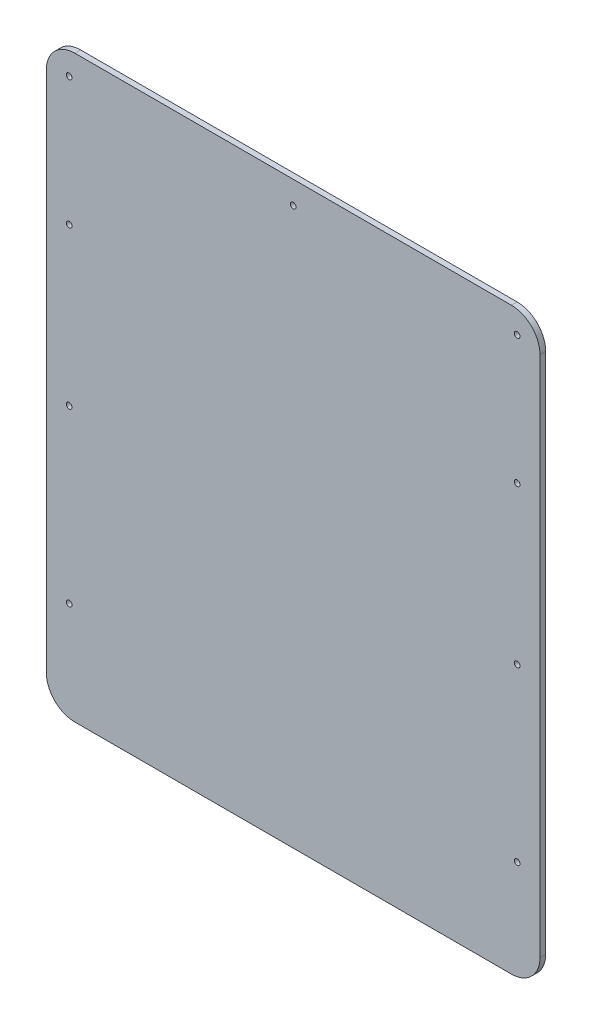
ISO-10303-21;
HEADER;
FILE_DESCRIPTION(('STEP AP214'),'2;1');
FILE_NAME('part.step','',(''),(''),'','','');
FILE_SCHEMA(('AUTOMOTIVE_DESIGN { 1 0 10303 214 1 1 1 1 }'));
ENDSEC;
DATA;
#1=APPLICATION_CONTEXT('core data for automotive mechanical design processes');
#2=APPLICATION_PROTOCOL_DEFINITION('international standard','automotive_design',2000,#1);
#3=PRODUCT_CONTEXT('',#1,'mechanical');
#4=PRODUCT('Part','Part','',(#3));
#5=PRODUCT_RELATED_PRODUCT_CATEGORY('part','',(#4));
#6=PRODUCT_DEFINITION_FORMATION('','',#4);
#7=PRODUCT_DEFINITION_CONTEXT('part definition',#1,'design');
#8=PRODUCT_DEFINITION('design','',#6,#7);
#9=PRODUCT_DEFINITION_SHAPE('','',#8);
#10=(LENGTH_UNIT() NAMED_UNIT(*) SI_UNIT(.MILLI.,.METRE.));
#11=(NAMED_UNIT(*) PLANE_ANGLE_UNIT() SI_UNIT($,.RADIAN.));
#12=(NAMED_UNIT(*) SI_UNIT($,.STERADIAN.) SOLID_ANGLE_UNIT());
#13=UNCERTAINTY_MEASURE_WITH_UNIT(LENGTH_MEASURE(1.E-05),#10,'distance_accuracy_value','');
#14=(GEOMETRIC_REPRESENTATION_CONTEXT(3) GLOBAL_UNCERTAINTY_ASSIGNED_CONTEXT((#13)) GLOBAL_UNIT_ASSIGNED_CONTEXT((#10,
#11,#12)) REPRESENTATION_CONTEXT('',''));
#15=CARTESIAN_POINT('',(0.,0.,0.));
#16=DIRECTION('',(0.,0.,1.));
#17=DIRECTION('',(1.,0.,0.));
#18=AXIS2_PLACEMENT_3D('',#15,#16,#17);
#19=CARTESIAN_POINT('',(-153.,183.,4.));
#20=DIRECTION('',(0.,0.,-1.));
#21=DIRECTION('',(-1.,0.,0.));
#22=AXIS2_PLACEMENT_3D('',#19,#20,#21);
#23=CYLINDRICAL_SURFACE('',#22,20.);
#24=CARTESIAN_POINT('',(-153.,183.,0.));
#25=DIRECTION('',(0.,0.,1.));
#26=DIRECTION('',(1.,0.,0.));
#27=AXIS2_PLACEMENT_3D('',#24,#25,#26);
#28=CIRCLE('',#27,20.);
#29=CARTESIAN_POINT('',(-173.,183.,0.));
#30=VERTEX_POINT('',#29);
#31=CARTESIAN_POINT('',(-153.,203.,0.));
#32=VERTEX_POINT('',#31);
#33=EDGE_CURVE('E158',#30,#32,#28,.F.);
#34=ORIENTED_EDGE('',*,*,#33,.F.);
#35=DIRECTION('',(0.,0.,-1.));
#36=VECTOR('',#35,1.);
#37=CARTESIAN_POINT('',(-173.,183.,4.));
#38=LINE('',#37,#36);
#39=CARTESIAN_POINT('',(-173.,183.,4.));
#40=VERTEX_POINT('',#39);
#41=EDGE_CURVE('E11',#40,#30,#38,.T.);
#42=ORIENTED_EDGE('',*,*,#41,.F.);
#43=CARTESIAN_POINT('',(-153.,183.,4.));
#44=DIRECTION('',(0.,0.,1.));
#45=DIRECTION('',(1.,0.,0.));
#46=AXIS2_PLACEMENT_3D('',#43,#44,#45);
#47=CIRCLE('',#46,20.);
#48=CARTESIAN_POINT('',(-153.,203.,4.));
#49=VERTEX_POINT('',#48);
#50=EDGE_CURVE('E205',#40,#49,#47,.F.);
#51=ORIENTED_EDGE('',*,*,#50,.T.);
#52=DIRECTION('',(0.,0.,-1.));
#53=VECTOR('',#52,1.);
#54=CARTESIAN_POINT('',(-153.,203.,4.));
#55=LINE('',#54,#53);
#56=EDGE_CURVE('E51',#49,#32,#55,.T.);
#57=ORIENTED_EDGE('',*,*,#56,.T.);
#58=EDGE_LOOP('',(#34,#42,#51,#57));
#59=FACE_BOUND('',#58,.T.);
#60=ADVANCED_FACE('F35',(#59),#23,.T.);
#61=CARTESIAN_POINT('',(-173.,0.,4.));
#62=DIRECTION('',(1.,0.,0.));
#63=DIRECTION('',(0.,1.,0.));
#64=AXIS2_PLACEMENT_3D('',#61,#62,#63);
#65=PLANE('',#64);
#66=DIRECTION('',(0.,-1.,0.));
#67=VECTOR('',#66,1.);
#68=CARTESIAN_POINT('',(-173.,0.,0.));
#69=LINE('',#68,#67);
#70=CARTESIAN_POINT('',(-173.,-183.,0.));
#71=VERTEX_POINT('',#70);
#72=EDGE_CURVE('E160',#30,#71,#69,.T.);
#73=ORIENTED_EDGE('',*,*,#72,.T.);
#74=DIRECTION('',(0.,0.,-1.));
#75=VECTOR('',#74,1.);
#76=CARTESIAN_POINT('',(-173.,-183.,4.));
#77=LINE('',#76,#75);
#78=CARTESIAN_POINT('',(-173.,-183.,4.));
#79=VERTEX_POINT('',#78);
#80=EDGE_CURVE('E43',#79,#71,#77,.T.);
#81=ORIENTED_EDGE('',*,*,#80,.F.);
#82=DIRECTION('',(0.,-1.,0.));
#83=VECTOR('',#82,1.);
#84=CARTESIAN_POINT('',(-173.,0.,4.));
#85=LINE('',#84,#83);
#86=EDGE_CURVE('E231',#40,#79,#85,.T.);
#87=ORIENTED_EDGE('',*,*,#86,.F.);
#88=ORIENTED_EDGE('',*,*,#41,.T.);
#89=EDGE_LOOP('',(#73,#81,#87,#88));
#90=FACE_BOUND('',#89,.T.);
#91=ADVANCED_FACE('F221',(#90),#65,.F.);
#92=CARTESIAN_POINT('',(-153.,-183.,4.));
#93=DIRECTION('',(0.,0.,-1.));
#94=DIRECTION('',(-1.,0.,0.));
#95=AXIS2_PLACEMENT_3D('',#92,#93,#94);
#96=CYLINDRICAL_SURFACE('',#95,20.);
#97=CARTESIAN_POINT('',(-153.,-183.,0.));
#98=DIRECTION('',(0.,0.,1.));
#99=DIRECTION('',(1.,0.,0.));
#100=AXIS2_PLACEMENT_3D('',#97,#98,#99);
#101=CIRCLE('',#100,20.);
#102=CARTESIAN_POINT('',(-153.,-203.,0.));
#103=VERTEX_POINT('',#102);
#104=EDGE_CURVE('E163',#103,#71,#101,.F.);
#105=ORIENTED_EDGE('',*,*,#104,.F.);
#106=DIRECTION('',(0.,0.,-1.));
#107=VECTOR('',#106,1.);
#108=CARTESIAN_POINT('',(-153.,-203.,4.));
#109=LINE('',#108,#107);
#110=CARTESIAN_POINT('',(-153.,-203.,4.));
#111=VERTEX_POINT('',#110);
#112=EDGE_CURVE('E211',#111,#103,#109,.T.);
#113=ORIENTED_EDGE('',*,*,#112,.F.);
#114=CARTESIAN_POINT('',(-153.,-183.,4.));
#115=DIRECTION('',(0.,0.,1.));
#116=DIRECTION('',(1.,0.,0.));
#117=AXIS2_PLACEMENT_3D('',#114,#115,#116);
#118=CIRCLE('',#117,20.);
#119=EDGE_CURVE('E218',#111,#79,#118,.F.);
#120=ORIENTED_EDGE('',*,*,#119,.T.);
#121=ORIENTED_EDGE('',*,*,#80,.T.);
#122=EDGE_LOOP('',(#105,#113,#120,#121));
#123=FACE_BOUND('',#122,.T.);
#124=ADVANCED_FACE('F216',(#123),#96,.T.);
#125=CARTESIAN_POINT('',(0.,-203.,4.));
#126=DIRECTION('',(0.,1.,0.));
#127=DIRECTION('',(0.,0.,1.));
#128=AXIS2_PLACEMENT_3D('',#125,#126,#127);
#129=PLANE('',#128);
#130=DIRECTION('',(1.,0.,0.));
#131=VECTOR('',#130,1.);
#132=CARTESIAN_POINT('',(0.,-203.,0.));
#133=LINE('',#132,#131);
#134=CARTESIAN_POINT('',(153.,-203.,0.));
#135=VERTEX_POINT('',#134);
#136=EDGE_CURVE('E166',#103,#135,#133,.T.);
#137=ORIENTED_EDGE('',*,*,#136,.T.);
#138=DIRECTION('',(0.,0.,-1.));
#139=VECTOR('',#138,1.);
#140=CARTESIAN_POINT('',(153.,-203.,4.));
#141=LINE('',#140,#139);
#142=CARTESIAN_POINT('',(153.,-203.,4.));
#143=VERTEX_POINT('',#142);
#144=EDGE_CURVE('E209',#143,#135,#141,.T.);
#145=ORIENTED_EDGE('',*,*,#144,.F.);
#146=DIRECTION('',(1.,0.,0.));
#147=VECTOR('',#146,1.);
#148=CARTESIAN_POINT('',(0.,-203.,4.));
#149=LINE('',#148,#147);
#150=EDGE_CURVE('E126',#111,#143,#149,.T.);
#151=ORIENTED_EDGE('',*,*,#150,.F.);
#152=ORIENTED_EDGE('',*,*,#112,.T.);
#153=EDGE_LOOP('',(#137,#145,#151,#152));
#154=FACE_BOUND('',#153,.T.);
#155=ADVANCED_FACE('F229',(#154),#129,.F.);
#156=CARTESIAN_POINT('',(153.,-183.,4.));
#157=DIRECTION('',(0.,0.,-1.));
#158=DIRECTION('',(-1.,0.,0.));
#159=AXIS2_PLACEMENT_3D('',#156,#157,#158);
#160=CYLINDRICAL_SURFACE('',#159,20.);
#161=CARTESIAN_POINT('',(153.,-183.,0.));
#162=DIRECTION('',(0.,0.,1.));
#163=DIRECTION('',(1.,0.,0.));
#164=AXIS2_PLACEMENT_3D('',#161,#162,#163);
#165=CIRCLE('',#164,20.);
#166=CARTESIAN_POINT('',(173.,-183.,0.));
#167=VERTEX_POINT('',#166);
#168=EDGE_CURVE('E169',#167,#135,#165,.F.);
#169=ORIENTED_EDGE('',*,*,#168,.F.);
#170=DIRECTION('',(0.,0.,-1.));
#171=VECTOR('',#170,1.);
#172=CARTESIAN_POINT('',(173.,-183.,4.));
#173=LINE('',#172,#171);
#174=CARTESIAN_POINT('',(173.,-183.,4.));
#175=VERTEX_POINT('',#174);
#176=EDGE_CURVE('E111',#175,#167,#173,.T.);
#177=ORIENTED_EDGE('',*,*,#176,.F.);
#178=CARTESIAN_POINT('',(153.,-183.,4.));
#179=DIRECTION('',(0.,0.,1.));
#180=DIRECTION('',(1.,0.,0.));
#181=AXIS2_PLACEMENT_3D('',#178,#179,#180);
#182=CIRCLE('',#181,20.);
#183=EDGE_CURVE('E124',#175,#143,#182,.F.);
#184=ORIENTED_EDGE('',*,*,#183,.T.);
#185=ORIENTED_EDGE('',*,*,#144,.T.);
#186=EDGE_LOOP('',(#169,#177,#184,#185));
#187=FACE_BOUND('',#186,.T.);
#188=ADVANCED_FACE('F261',(#187),#160,.T.);
#189=CARTESIAN_POINT('',(173.,0.,4.));
#190=DIRECTION('',(1.,0.,0.));
#191=DIRECTION('',(0.,1.,0.));
#192=AXIS2_PLACEMENT_3D('',#189,#190,#191);
#193=PLANE('',#192);
#194=DIRECTION('',(0.,-1.,0.));
#195=VECTOR('',#194,1.);
#196=CARTESIAN_POINT('',(173.,0.,0.));
#197=LINE('',#196,#195);
#198=CARTESIAN_POINT('',(173.,183.,0.));
#199=VERTEX_POINT('',#198);
#200=EDGE_CURVE('E108',#199,#167,#197,.T.);
#201=ORIENTED_EDGE('',*,*,#200,.F.);
#202=DIRECTION('',(0.,0.,-1.));
#203=VECTOR('',#202,1.);
#204=CARTESIAN_POINT('',(173.,183.,4.));
#205=LINE('',#204,#203);
#206=CARTESIAN_POINT('',(173.,183.,4.));
#207=VERTEX_POINT('',#206);
#208=EDGE_CURVE('E102',#207,#199,#205,.T.);
#209=ORIENTED_EDGE('',*,*,#208,.F.);
#210=DIRECTION('',(0.,-1.,0.));
#211=VECTOR('',#210,1.);
#212=CARTESIAN_POINT('',(173.,0.,4.));
#213=LINE('',#212,#211);
#214=EDGE_CURVE('E106',#207,#175,#213,.T.);
#215=ORIENTED_EDGE('',*,*,#214,.T.);
#216=ORIENTED_EDGE('',*,*,#176,.T.);
#217=EDGE_LOOP('',(#201,#209,#215,#216));
#218=FACE_BOUND('',#217,.T.);
#219=ADVANCED_FACE('F104',(#218),#193,.T.);
#220=CARTESIAN_POINT('',(153.,183.,4.));
#221=DIRECTION('',(0.,0.,-1.));
#222=DIRECTION('',(-1.,0.,0.));
#223=AXIS2_PLACEMENT_3D('',#220,#221,#222);
#224=CYLINDRICAL_SURFACE('',#223,20.);
#225=CARTESIAN_POINT('',(153.,183.,0.));
#226=DIRECTION('',(0.,0.,1.));
#227=DIRECTION('',(1.,0.,0.));
#228=AXIS2_PLACEMENT_3D('',#225,#226,#227);
#229=CIRCLE('',#228,20.);
#230=CARTESIAN_POINT('',(153.,203.,0.));
#231=VERTEX_POINT('',#230);
#232=EDGE_CURVE('E173',#199,#231,#229,.T.);
#233=ORIENTED_EDGE('',*,*,#232,.T.);
#234=DIRECTION('',(0.,0.,-1.));
#235=VECTOR('',#234,1.);
#236=CARTESIAN_POINT('',(153.,203.,4.));
#237=LINE('',#236,#235);
#238=CARTESIAN_POINT('',(153.,203.,4.));
#239=VERTEX_POINT('',#238);
#240=EDGE_CURVE('E77',#239,#231,#237,.T.);
#241=ORIENTED_EDGE('',*,*,#240,.F.);
#242=CARTESIAN_POINT('',(153.,183.,4.));
#243=DIRECTION('',(0.,0.,1.));
#244=DIRECTION('',(1.,0.,0.));
#245=AXIS2_PLACEMENT_3D('',#242,#243,#244);
#246=CIRCLE('',#245,20.);
#247=EDGE_CURVE('E113',#207,#239,#246,.T.);
#248=ORIENTED_EDGE('',*,*,#247,.F.);
#249=ORIENTED_EDGE('',*,*,#208,.T.);
#250=EDGE_LOOP('',(#233,#241,#248,#249));
#251=FACE_BOUND('',#250,.T.);
#252=ADVANCED_FACE('F114',(#251),#224,.T.);
#253=CARTESIAN_POINT('',(157.,-13.,4.));
#254=DIRECTION('',(0.,0.,-1.));
#255=DIRECTION('',(-1.,0.,0.));
#256=AXIS2_PLACEMENT_3D('',#253,#254,#255);
#257=CYLINDRICAL_SURFACE('',#256,2.);
#258=CARTESIAN_POINT('',(157.,-13.,4.));
#259=DIRECTION('',(0.,0.,1.));
#260=DIRECTION('',(1.,0.,0.));
#261=AXIS2_PLACEMENT_3D('',#258,#259,#260);
#262=CIRCLE('',#261,2.);
#263=CARTESIAN_POINT('',(159.,-13.,4.));
#264=VERTEX_POINT('',#263);
#265=EDGE_CURVE('E152',#264,#264,#262,.F.);
#266=ORIENTED_EDGE('',*,*,#265,.F.);
#267=EDGE_LOOP('',(#266));
#268=FACE_BOUND('',#267,.T.);
#269=CARTESIAN_POINT('',(157.,-13.,0.));
#270=DIRECTION('',(0.,0.,1.));
#271=DIRECTION('',(1.,0.,0.));
#272=AXIS2_PLACEMENT_3D('',#269,#270,#271);
#273=CIRCLE('',#272,2.);
#274=CARTESIAN_POINT('',(159.,-13.,0.));
#275=VERTEX_POINT('',#274);
#276=EDGE_CURVE('E199',#275,#275,#273,.F.);
#277=ORIENTED_EDGE('',*,*,#276,.T.);
#278=EDGE_LOOP('',(#277));
#279=FACE_BOUND('',#278,.T.);
#280=ADVANCED_FACE('F267',(#268,#279),#257,.F.);
#281=CARTESIAN_POINT('',(-157.,187.,4.));
#282=DIRECTION('',(0.,0.,-1.));
#283=DIRECTION('',(-1.,0.,0.));
#284=AXIS2_PLACEMENT_3D('',#281,#282,#283);
#285=CYLINDRICAL_SURFACE('',#284,2.);
#286=CARTESIAN_POINT('',(-157.,187.,4.));
#287=DIRECTION('',(0.,0.,1.));
#288=DIRECTION('',(1.,0.,0.));
#289=AXIS2_PLACEMENT_3D('',#286,#287,#288);
#290=CIRCLE('',#289,2.);
#291=CARTESIAN_POINT('',(-155.,187.,4.));
#292=VERTEX_POINT('',#291);
#293=EDGE_CURVE('E149',#292,#292,#290,.T.);
#294=ORIENTED_EDGE('',*,*,#293,.T.);
#295=EDGE_LOOP('',(#294));
#296=FACE_BOUND('',#295,.T.);
#297=CARTESIAN_POINT('',(-157.,187.,0.));
#298=DIRECTION('',(0.,0.,1.));
#299=DIRECTION('',(1.,0.,0.));
#300=AXIS2_PLACEMENT_3D('',#297,#298,#299);
#301=CIRCLE('',#300,2.);
#302=CARTESIAN_POINT('',(-155.,187.,0.));
#303=VERTEX_POINT('',#302);
#304=EDGE_CURVE('E196',#303,#303,#301,.T.);
#305=ORIENTED_EDGE('',*,*,#304,.F.);
#306=EDGE_LOOP('',(#305));
#307=FACE_BOUND('',#306,.T.);
#308=ADVANCED_FACE('F271',(#296,#307),#285,.F.);
#309=CARTESIAN_POINT('',(-157.,97.,4.));
#310=DIRECTION('',(0.,0.,-1.));
#311=DIRECTION('',(-1.,0.,0.));
#312=AXIS2_PLACEMENT_3D('',#309,#310,#311);
#313=CYLINDRICAL_SURFACE('',#312,2.);
#314=CARTESIAN_POINT('',(-157.,97.,4.));
#315=DIRECTION('',(0.,0.,1.));
#316=DIRECTION('',(1.,0.,0.));
#317=AXIS2_PLACEMENT_3D('',#314,#315,#316);
#318=CIRCLE('',#317,2.);
#319=CARTESIAN_POINT('',(-155.,97.,4.));
#320=VERTEX_POINT('',#319);
#321=EDGE_CURVE('E146',#320,#320,#318,.T.);
#322=ORIENTED_EDGE('',*,*,#321,.T.);
#323=EDGE_LOOP('',(#322));
#324=FACE_BOUND('',#323,.T.);
#325=CARTESIAN_POINT('',(-157.,97.,0.));
#326=DIRECTION('',(0.,0.,1.));
#327=DIRECTION('',(1.,0.,0.));
#328=AXIS2_PLACEMENT_3D('',#325,#326,#327);
#329=CIRCLE('',#328,2.);
#330=CARTESIAN_POINT('',(-155.,97.,0.));
#331=VERTEX_POINT('',#330);
#332=EDGE_CURVE('E193',#331,#331,#329,.T.);
#333=ORIENTED_EDGE('',*,*,#332,.F.);
#334=EDGE_LOOP('',(#333));
#335=FACE_BOUND('',#334,.T.);
#336=ADVANCED_FACE('F277',(#324,#335),#313,.F.);
#337=CARTESIAN_POINT('',(-157.,-13.,4.));
#338=DIRECTION('',(0.,0.,-1.));
#339=DIRECTION('',(-1.,0.,0.));
#340=AXIS2_PLACEMENT_3D('',#337,#338,#339);
#341=CYLINDRICAL_SURFACE('',#340,2.);
#342=CARTESIAN_POINT('',(-157.,-13.,4.));
#343=DIRECTION('',(0.,0.,1.));
#344=DIRECTION('',(1.,0.,0.));
#345=AXIS2_PLACEMENT_3D('',#342,#343,#344);
#346=CIRCLE('',#345,2.);
#347=CARTESIAN_POINT('',(-155.,-13.,4.));
#348=VERTEX_POINT('',#347);
#349=EDGE_CURVE('E143',#348,#348,#346,.T.);
#350=ORIENTED_EDGE('',*,*,#349,.T.);
#351=EDGE_LOOP('',(#350));
#352=FACE_BOUND('',#351,.T.);
#353=CARTESIAN_POINT('',(-157.,-13.,0.));
#354=DIRECTION('',(0.,0.,1.));
#355=DIRECTION('',(1.,0.,0.));
#356=AXIS2_PLACEMENT_3D('',#353,#354,#355);
#357=CIRCLE('',#356,2.);
#358=CARTESIAN_POINT('',(-155.,-13.,0.));
#359=VERTEX_POINT('',#358);
#360=EDGE_CURVE('E190',#359,#359,#357,.T.);
#361=ORIENTED_EDGE('',*,*,#360,.F.);
#362=EDGE_LOOP('',(#361));
#363=FACE_BOUND('',#362,.T.);
#364=ADVANCED_FACE('F286',(#352,#363),#341,.F.);
#365=CARTESIAN_POINT('',(-157.,-133.,4.));
#366=DIRECTION('',(0.,0.,-1.));
#367=DIRECTION('',(-1.,0.,0.));
#368=AXIS2_PLACEMENT_3D('',#365,#366,#367);
#369=CYLINDRICAL_SURFACE('',#368,2.);
#370=CARTESIAN_POINT('',(-157.,-133.,4.));
#371=DIRECTION('',(0.,0.,1.));
#372=DIRECTION('',(1.,0.,0.));
#373=AXIS2_PLACEMENT_3D('',#370,#371,#372);
#374=CIRCLE('',#373,2.);
#375=CARTESIAN_POINT('',(-155.,-133.,4.));
#376=VERTEX_POINT('',#375);
#377=EDGE_CURVE('E140',#376,#376,#374,.T.);
#378=ORIENTED_EDGE('',*,*,#377,.T.);
#379=EDGE_LOOP('',(#378));
#380=FACE_BOUND('',#379,.T.);
#381=CARTESIAN_POINT('',(-157.,-133.,0.));
#382=DIRECTION('',(0.,0.,1.));
#383=DIRECTION('',(1.,0.,0.));
#384=AXIS2_PLACEMENT_3D('',#381,#382,#383);
#385=CIRCLE('',#384,2.);
#386=CARTESIAN_POINT('',(-155.,-133.,0.));
#387=VERTEX_POINT('',#386);
#388=EDGE_CURVE('E187',#387,#387,#385,.T.);
#389=ORIENTED_EDGE('',*,*,#388,.F.);
#390=EDGE_LOOP('',(#389));
#391=FACE_BOUND('',#390,.T.);
#392=ADVANCED_FACE('F290',(#380,#391),#369,.F.);
#393=CARTESIAN_POINT('',(157.,-133.,4.));
#394=DIRECTION('',(0.,0.,-1.));
#395=DIRECTION('',(-1.,0.,0.));
#396=AXIS2_PLACEMENT_3D('',#393,#394,#395);
#397=CYLINDRICAL_SURFACE('',#396,2.);
#398=CARTESIAN_POINT('',(157.,-133.,4.));
#399=DIRECTION('',(0.,0.,1.));
#400=DIRECTION('',(1.,0.,0.));
#401=AXIS2_PLACEMENT_3D('',#398,#399,#400);
#402=CIRCLE('',#401,2.);
#403=CARTESIAN_POINT('',(159.,-133.,4.));
#404=VERTEX_POINT('',#403);
#405=EDGE_CURVE('E137',#404,#404,#402,.F.);
#406=ORIENTED_EDGE('',*,*,#405,.F.);
#407=EDGE_LOOP('',(#406));
#408=FACE_BOUND('',#407,.T.);
#409=CARTESIAN_POINT('',(157.,-133.,0.));
#410=DIRECTION('',(0.,0.,1.));
#411=DIRECTION('',(1.,0.,0.));
#412=AXIS2_PLACEMENT_3D('',#409,#410,#411);
#413=CIRCLE('',#412,2.);
#414=CARTESIAN_POINT('',(159.,-133.,0.));
#415=VERTEX_POINT('',#414);
#416=EDGE_CURVE('E184',#415,#415,#413,.F.);
#417=ORIENTED_EDGE('',*,*,#416,.T.);
#418=EDGE_LOOP('',(#417));
#419=FACE_BOUND('',#418,.T.);
#420=ADVANCED_FACE('F294',(#408,#419),#397,.F.);
#421=CARTESIAN_POINT('',(157.,97.,4.));
#422=DIRECTION('',(0.,0.,-1.));
#423=DIRECTION('',(-1.,0.,0.));
#424=AXIS2_PLACEMENT_3D('',#421,#422,#423);
#425=CYLINDRICAL_SURFACE('',#424,2.);
#426=CARTESIAN_POINT('',(157.,97.,4.));
#427=DIRECTION('',(0.,0.,1.));
#428=DIRECTION('',(1.,0.,0.));
#429=AXIS2_PLACEMENT_3D('',#426,#427,#428);
#430=CIRCLE('',#429,2.);
#431=CARTESIAN_POINT('',(159.,97.,4.));
#432=VERTEX_POINT('',#431);
#433=EDGE_CURVE('E134',#432,#432,#430,.F.);
#434=ORIENTED_EDGE('',*,*,#433,.F.);
#435=EDGE_LOOP('',(#434));
#436=FACE_BOUND('',#435,.T.);
#437=CARTESIAN_POINT('',(157.,97.,0.));
#438=DIRECTION('',(0.,0.,1.));
#439=DIRECTION('',(1.,0.,0.));
#440=AXIS2_PLACEMENT_3D('',#437,#438,#439);
#441=CIRCLE('',#440,2.);
#442=CARTESIAN_POINT('',(159.,97.,0.));
#443=VERTEX_POINT('',#442);
#444=EDGE_CURVE('E181',#443,#443,#441,.F.);
#445=ORIENTED_EDGE('',*,*,#444,.T.);
#446=EDGE_LOOP('',(#445));
#447=FACE_BOUND('',#446,.T.);
#448=ADVANCED_FACE('F246',(#436,#447),#425,.F.);
#449=CARTESIAN_POINT('',(0.,187.,4.));
#450=DIRECTION('',(0.,0.,-1.));
#451=DIRECTION('',(-1.,0.,0.));
#452=AXIS2_PLACEMENT_3D('',#449,#450,#451);
#453=CYLINDRICAL_SURFACE('',#452,2.);
#454=CARTESIAN_POINT('',(0.,187.,4.));
#455=DIRECTION('',(0.,0.,1.));
#456=DIRECTION('',(1.,0.,0.));
#457=AXIS2_PLACEMENT_3D('',#454,#455,#456);
#458=CIRCLE('',#457,2.);
#459=CARTESIAN_POINT('',(2.00000000000001,187.,4.));
#460=VERTEX_POINT('',#459);
#461=EDGE_CURVE('E131',#460,#460,#458,.T.);
#462=ORIENTED_EDGE('',*,*,#461,.T.);
#463=EDGE_LOOP('',(#462));
#464=FACE_BOUND('',#463,.T.);
#465=CARTESIAN_POINT('',(0.,187.,0.));
#466=DIRECTION('',(0.,0.,1.));
#467=DIRECTION('',(1.,0.,0.));
#468=AXIS2_PLACEMENT_3D('',#465,#466,#467);
#469=CIRCLE('',#468,2.);
#470=CARTESIAN_POINT('',(2.00000000000001,187.,0.));
#471=VERTEX_POINT('',#470);
#472=EDGE_CURVE('E178',#471,#471,#469,.T.);
#473=ORIENTED_EDGE('',*,*,#472,.F.);
#474=EDGE_LOOP('',(#473));
#475=FACE_BOUND('',#474,.T.);
#476=ADVANCED_FACE('F238',(#464,#475),#453,.F.);
#477=CARTESIAN_POINT('',(0.,203.,4.));
#478=DIRECTION('',(0.,1.,0.));
#479=DIRECTION('',(0.,0.,1.));
#480=AXIS2_PLACEMENT_3D('',#477,#478,#479);
#481=PLANE('',#480);
#482=DIRECTION('',(1.,0.,0.));
#483=VECTOR('',#482,1.);
#484=CARTESIAN_POINT('',(0.,203.,0.));
#485=LINE('',#484,#483);
#486=EDGE_CURVE('E175',#32,#231,#485,.T.);
#487=ORIENTED_EDGE('',*,*,#486,.F.);
#488=ORIENTED_EDGE('',*,*,#56,.F.);
#489=DIRECTION('',(1.,0.,0.));
#490=VECTOR('',#489,1.);
#491=CARTESIAN_POINT('',(0.,203.,4.));
#492=LINE('',#491,#490);
#493=EDGE_CURVE('E117',#49,#239,#492,.T.);
#494=ORIENTED_EDGE('',*,*,#493,.T.);
#495=ORIENTED_EDGE('',*,*,#240,.T.);
#496=EDGE_LOOP('',(#487,#488,#494,#495));
#497=FACE_BOUND('',#496,.T.);
#498=ADVANCED_FACE('F235',(#497),#481,.T.);
#499=CARTESIAN_POINT('',(157.,187.,4.));
#500=DIRECTION('',(0.,0.,-1.));
#501=DIRECTION('',(-1.,0.,0.));
#502=AXIS2_PLACEMENT_3D('',#499,#500,#501);
#503=CYLINDRICAL_SURFACE('',#502,2.);
#504=CARTESIAN_POINT('',(157.,187.,4.));
#505=DIRECTION('',(0.,0.,1.));
#506=DIRECTION('',(1.,0.,0.));
#507=AXIS2_PLACEMENT_3D('',#504,#505,#506);
#508=CIRCLE('',#507,2.);
#509=CARTESIAN_POINT('',(159.,187.,4.));
#510=VERTEX_POINT('',#509);
#511=EDGE_CURVE('E155',#510,#510,#508,.F.);
#512=ORIENTED_EDGE('',*,*,#511,.F.);
#513=EDGE_LOOP('',(#512));
#514=FACE_BOUND('',#513,.T.);
#515=CARTESIAN_POINT('',(157.,187.,0.));
#516=DIRECTION('',(0.,0.,1.));
#517=DIRECTION('',(1.,0.,0.));
#518=AXIS2_PLACEMENT_3D('',#515,#516,#517);
#519=CIRCLE('',#518,2.);
#520=CARTESIAN_POINT('',(159.,187.,0.));
#521=VERTEX_POINT('',#520);
#522=EDGE_CURVE('E202',#521,#521,#519,.F.);
#523=ORIENTED_EDGE('',*,*,#522,.T.);
#524=EDGE_LOOP('',(#523));
#525=FACE_BOUND('',#524,.T.);
#526=ADVANCED_FACE('F237',(#514,#525),#503,.F.);
#527=CARTESIAN_POINT('',(0.,0.,4.));
#528=DIRECTION('',(0.,0.,1.));
#529=DIRECTION('',(1.,0.,0.));
#530=AXIS2_PLACEMENT_3D('',#527,#528,#529);
#531=PLANE('',#530);
#532=ORIENTED_EDGE('',*,*,#50,.F.);
#533=ORIENTED_EDGE('',*,*,#86,.T.);
#534=ORIENTED_EDGE('',*,*,#119,.F.);
#535=ORIENTED_EDGE('',*,*,#150,.T.);
#536=ORIENTED_EDGE('',*,*,#183,.F.);
#537=ORIENTED_EDGE('',*,*,#214,.F.);
#538=ORIENTED_EDGE('',*,*,#247,.T.);
#539=ORIENTED_EDGE('',*,*,#493,.F.);
#540=EDGE_LOOP('',(#532,#533,#534,#535,#536,#537,#538,#539));
#541=FACE_BOUND('',#540,.T.);
#542=ORIENTED_EDGE('',*,*,#461,.F.);
#543=EDGE_LOOP('',(#542));
#544=FACE_BOUND('',#543,.T.);
#545=ORIENTED_EDGE('',*,*,#433,.T.);
#546=EDGE_LOOP('',(#545));
#547=FACE_BOUND('',#546,.T.);
#548=ORIENTED_EDGE('',*,*,#405,.T.);
#549=EDGE_LOOP('',(#548));
#550=FACE_BOUND('',#549,.T.);
#551=ORIENTED_EDGE('',*,*,#377,.F.);
#552=EDGE_LOOP('',(#551));
#553=FACE_BOUND('',#552,.T.);
#554=ORIENTED_EDGE('',*,*,#349,.F.);
#555=EDGE_LOOP('',(#554));
#556=FACE_BOUND('',#555,.T.);
#557=ORIENTED_EDGE('',*,*,#321,.F.);
#558=EDGE_LOOP('',(#557));
#559=FACE_BOUND('',#558,.T.);
#560=ORIENTED_EDGE('',*,*,#293,.F.);
#561=EDGE_LOOP('',(#560));
#562=FACE_BOUND('',#561,.T.);
#563=ORIENTED_EDGE('',*,*,#265,.T.);
#564=EDGE_LOOP('',(#563));
#565=FACE_BOUND('',#564,.T.);
#566=ORIENTED_EDGE('',*,*,#511,.T.);
#567=EDGE_LOOP('',(#566));
#568=FACE_BOUND('',#567,.T.);
#569=ADVANCED_FACE('F121',(#541,#544,#547,#550,#553,#556,#559,#562,#565,#568),#531,.T.);
#570=CARTESIAN_POINT('',(0.,0.,0.));
#571=DIRECTION('',(0.,0.,1.));
#572=DIRECTION('',(1.,0.,0.));
#573=AXIS2_PLACEMENT_3D('',#570,#571,#572);
#574=PLANE('',#573);
#575=ORIENTED_EDGE('',*,*,#33,.T.);
#576=ORIENTED_EDGE('',*,*,#486,.T.);
#577=ORIENTED_EDGE('',*,*,#232,.F.);
#578=ORIENTED_EDGE('',*,*,#200,.T.);
#579=ORIENTED_EDGE('',*,*,#168,.T.);
#580=ORIENTED_EDGE('',*,*,#136,.F.);
#581=ORIENTED_EDGE('',*,*,#104,.T.);
#582=ORIENTED_EDGE('',*,*,#72,.F.);
#583=EDGE_LOOP('',(#575,#576,#577,#578,#579,#580,#581,#582));
#584=FACE_BOUND('',#583,.T.);
#585=ORIENTED_EDGE('',*,*,#472,.T.);
#586=EDGE_LOOP('',(#585));
#587=FACE_BOUND('',#586,.T.);
#588=ORIENTED_EDGE('',*,*,#444,.F.);
#589=EDGE_LOOP('',(#588));
#590=FACE_BOUND('',#589,.T.);
#591=ORIENTED_EDGE('',*,*,#416,.F.);
#592=EDGE_LOOP('',(#591));
#593=FACE_BOUND('',#592,.T.);
#594=ORIENTED_EDGE('',*,*,#388,.T.);
#595=EDGE_LOOP('',(#594));
#596=FACE_BOUND('',#595,.T.);
#597=ORIENTED_EDGE('',*,*,#360,.T.);
#598=EDGE_LOOP('',(#597));
#599=FACE_BOUND('',#598,.T.);
#600=ORIENTED_EDGE('',*,*,#332,.T.);
#601=EDGE_LOOP('',(#600));
#602=FACE_BOUND('',#601,.T.);
#603=ORIENTED_EDGE('',*,*,#304,.T.);
#604=EDGE_LOOP('',(#603));
#605=FACE_BOUND('',#604,.T.);
#606=ORIENTED_EDGE('',*,*,#276,.F.);
#607=EDGE_LOOP('',(#606));
#608=FACE_BOUND('',#607,.T.);
#609=ORIENTED_EDGE('',*,*,#522,.F.);
#610=EDGE_LOOP('',(#609));
#611=FACE_BOUND('',#610,.T.);
#612=ADVANCED_FACE('F224',(#584,#587,#590,#593,#596,#599,#602,#605,#608,#611),#574,.F.);
#613=CLOSED_SHELL('',(#60,#91,#124,#155,#188,#219,#252,#280,#308,#336,#364,#392,#420,#448,#476,
#498,#526,#569,#612));
#614=MANIFOLD_SOLID_BREP('B2',#613);
#615=ADVANCED_BREP_SHAPE_REPRESENTATION('',(#18,#614),#14);
#616=SHAPE_DEFINITION_REPRESENTATION(#9,#615);
ENDSEC;
END-ISO-10303-21;
